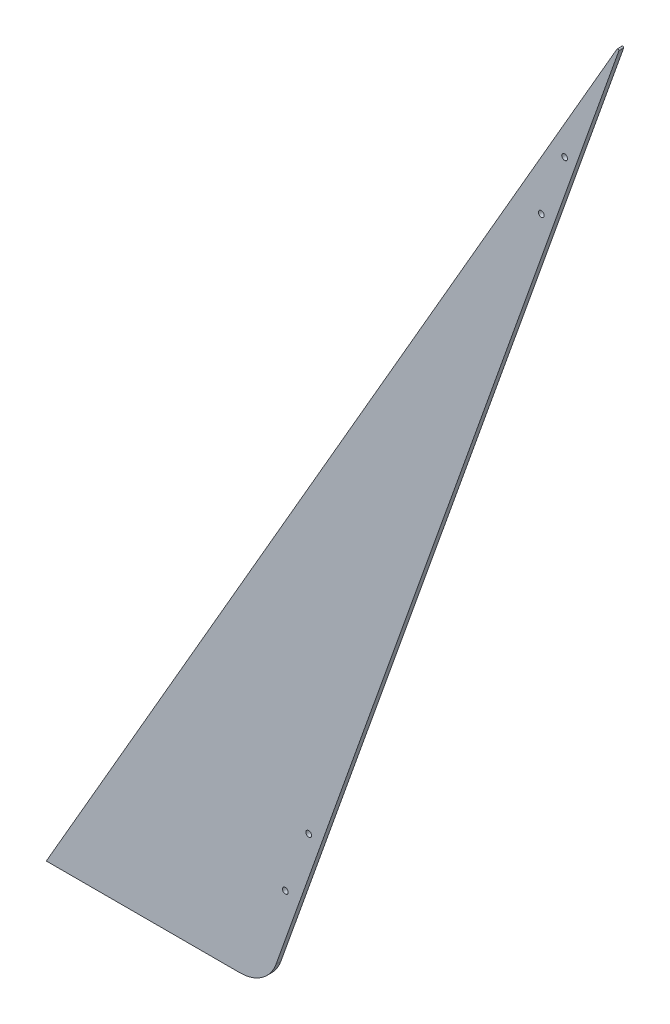
ISO-10303-21;
HEADER;
FILE_DESCRIPTION(('STEP AP214'),'2;1');
FILE_NAME('part.step','',(''),(''),'','','');
FILE_SCHEMA(('AUTOMOTIVE_DESIGN { 1 0 10303 214 1 1 1 1 }'));
ENDSEC;
DATA;
#1=APPLICATION_CONTEXT('core data for automotive mechanical design processes');
#2=APPLICATION_PROTOCOL_DEFINITION('international standard','automotive_design',2000,#1);
#3=PRODUCT_CONTEXT('',#1,'mechanical');
#4=PRODUCT('Part','Part','',(#3));
#5=PRODUCT_RELATED_PRODUCT_CATEGORY('part','',(#4));
#6=PRODUCT_DEFINITION_FORMATION('','',#4);
#7=PRODUCT_DEFINITION_CONTEXT('part definition',#1,'design');
#8=PRODUCT_DEFINITION('design','',#6,#7);
#9=PRODUCT_DEFINITION_SHAPE('','',#8);
#10=(LENGTH_UNIT() NAMED_UNIT(*) SI_UNIT(.MILLI.,.METRE.));
#11=(NAMED_UNIT(*) PLANE_ANGLE_UNIT() SI_UNIT($,.RADIAN.));
#12=(NAMED_UNIT(*) SI_UNIT($,.STERADIAN.) SOLID_ANGLE_UNIT());
#13=UNCERTAINTY_MEASURE_WITH_UNIT(LENGTH_MEASURE(1.E-05),#10,'distance_accuracy_value','');
#14=(GEOMETRIC_REPRESENTATION_CONTEXT(3) GLOBAL_UNCERTAINTY_ASSIGNED_CONTEXT((#13)) GLOBAL_UNIT_ASSIGNED_CONTEXT((#10,
#11,#12)) REPRESENTATION_CONTEXT('',''));
#15=CARTESIAN_POINT('',(0.,0.,0.));
#16=DIRECTION('',(0.,0.,1.));
#17=DIRECTION('',(1.,0.,0.));
#18=AXIS2_PLACEMENT_3D('',#15,#16,#17);
#19=CARTESIAN_POINT('',(600.444279957217,1040.,5.));
#20=DIRECTION('',(0.866025403784436,-0.500000000000004,0.));
#21=DIRECTION('',(0.500000000000004,0.866025403784436,0.));
#22=AXIS2_PLACEMENT_3D('',#19,#20,#21);
#23=PLANE('',#22);
#24=DIRECTION('',(-0.500000000000004,-0.866025403784436,0.));
#25=VECTOR('',#24,1.);
#26=CARTESIAN_POINT('',(600.444279957217,1040.,5.));
#27=LINE('',#26,#25);
#28=CARTESIAN_POINT('',(594.94716630705,1030.47871986293,5.));
#29=VERTEX_POINT('',#28);
#30=CARTESIAN_POINT('',(0.,0.,5.));
#31=VERTEX_POINT('',#30);
#32=EDGE_CURVE('E80',#29,#31,#27,.T.);
#33=ORIENTED_EDGE('',*,*,#32,.F.);
#34=DIRECTION('',(0.,0.,-1.));
#35=VECTOR('',#34,1.);
#36=CARTESIAN_POINT('',(594.94716630705,1030.47871986293,5.));
#37=LINE('',#36,#35);
#38=CARTESIAN_POINT('',(594.94716630705,1030.47871986293,0.));
#39=VERTEX_POINT('',#38);
#40=EDGE_CURVE('E116',#29,#39,#37,.T.);
#41=ORIENTED_EDGE('',*,*,#40,.T.);
#42=DIRECTION('',(-0.500000000000004,-0.866025403784436,0.));
#43=VECTOR('',#42,1.);
#44=CARTESIAN_POINT('',(600.444279957217,1040.,0.));
#45=LINE('',#44,#43);
#46=CARTESIAN_POINT('',(0.,0.,0.));
#47=VERTEX_POINT('',#46);
#48=EDGE_CURVE('E101',#39,#47,#45,.T.);
#49=ORIENTED_EDGE('',*,*,#48,.T.);
#50=DIRECTION('',(0.,0.,-1.));
#51=VECTOR('',#50,1.);
#52=CARTESIAN_POINT('',(0.,0.,5.));
#53=LINE('',#52,#51);
#54=EDGE_CURVE('E96',#31,#47,#53,.T.);
#55=ORIENTED_EDGE('',*,*,#54,.F.);
#56=EDGE_LOOP('',(#33,#41,#49,#55));
#57=FACE_BOUND('',#56,.T.);
#58=ADVANCED_FACE('F33',(#57),#23,.F.);
#59=CARTESIAN_POINT('',(0.,0.,5.));
#60=DIRECTION('',(0.,1.,0.));
#61=DIRECTION('',(0.,0.,1.));
#62=AXIS2_PLACEMENT_3D('',#59,#60,#61);
#63=PLANE('',#62);
#64=DIRECTION('',(1.,0.,0.));
#65=VECTOR('',#64,1.);
#66=CARTESIAN_POINT('',(0.,0.,0.));
#67=LINE('',#66,#65);
#68=CARTESIAN_POINT('',(201.786092628675,0.,0.));
#69=VERTEX_POINT('',#68);
#70=EDGE_CURVE('E120',#47,#69,#67,.T.);
#71=ORIENTED_EDGE('',*,*,#70,.T.);
#72=DIRECTION('',(0.,0.,-1.));
#73=VECTOR('',#72,1.);
#74=CARTESIAN_POINT('',(201.786092628675,0.,5.));
#75=LINE('',#74,#73);
#76=CARTESIAN_POINT('',(201.786092628675,0.,5.));
#77=VERTEX_POINT('',#76);
#78=EDGE_CURVE('E98',#69,#77,#75,.F.);
#79=ORIENTED_EDGE('',*,*,#78,.T.);
#80=DIRECTION('',(1.,0.,0.));
#81=VECTOR('',#80,1.);
#82=CARTESIAN_POINT('',(0.,0.,5.));
#83=LINE('',#82,#81);
#84=EDGE_CURVE('E83',#31,#77,#83,.T.);
#85=ORIENTED_EDGE('',*,*,#84,.F.);
#86=ORIENTED_EDGE('',*,*,#54,.T.);
#87=EDGE_LOOP('',(#71,#79,#85,#86));
#88=FACE_BOUND('',#87,.T.);
#89=ADVANCED_FACE('F95',(#88),#63,.F.);
#90=CARTESIAN_POINT('',(230.,0.,5.));
#91=DIRECTION('',(-0.942023975363263,0.335545570438345,0.));
#92=DIRECTION('',(-0.335545570438345,-0.942023975363263,0.));
#93=AXIS2_PLACEMENT_3D('',#90,#91,#92);
#94=PLANE('',#93);
#95=DIRECTION('',(0.335545570438345,0.942023975363263,0.));
#96=VECTOR('',#95,1.);
#97=CARTESIAN_POINT('',(230.,0.,0.));
#98=LINE('',#97,#96);
#99=CARTESIAN_POINT('',(239.467051643206,26.5781771824662,0.));
#100=VERTEX_POINT('',#99);
#101=CARTESIAN_POINT('',(596.755215686198,1029.64317429249,0.));
#102=VERTEX_POINT('',#101);
#103=EDGE_CURVE('E90',#100,#102,#98,.T.);
#104=ORIENTED_EDGE('',*,*,#103,.T.);
#105=DIRECTION('',(0.,0.,-1.));
#106=VECTOR('',#105,1.);
#107=CARTESIAN_POINT('',(596.755215686198,1029.64317429249,5.));
#108=LINE('',#107,#106);
#109=CARTESIAN_POINT('',(596.755215686198,1029.64317429249,5.));
#110=VERTEX_POINT('',#109);
#111=EDGE_CURVE('E41',#102,#110,#108,.F.);
#112=ORIENTED_EDGE('',*,*,#111,.T.);
#113=DIRECTION('',(0.335545570438345,0.942023975363263,0.));
#114=VECTOR('',#113,1.);
#115=CARTESIAN_POINT('',(230.,0.,5.));
#116=LINE('',#115,#114);
#117=CARTESIAN_POINT('',(239.467051643206,26.5781771824662,5.));
#118=VERTEX_POINT('',#117);
#119=EDGE_CURVE('E99',#118,#110,#116,.T.);
#120=ORIENTED_EDGE('',*,*,#119,.F.);
#121=DIRECTION('',(0.,0.,-1.));
#122=VECTOR('',#121,1.);
#123=CARTESIAN_POINT('',(239.467051643206,26.5781771824662,5.));
#124=LINE('',#123,#122);
#125=EDGE_CURVE('E103',#118,#100,#124,.T.);
#126=ORIENTED_EDGE('',*,*,#125,.T.);
#127=EDGE_LOOP('',(#104,#112,#120,#126));
#128=FACE_BOUND('',#127,.T.);
#129=ADVANCED_FACE('F152',(#128),#94,.F.);
#130=CARTESIAN_POINT('',(0.,0.,5.));
#131=DIRECTION('',(0.,0.,1.));
#132=DIRECTION('',(1.,0.,0.));
#133=AXIS2_PLACEMENT_3D('',#130,#131,#132);
#134=PLANE('',#133);
#135=CARTESIAN_POINT('',(249.14769163417,97.7585656821368,5.));
#136=DIRECTION('',(0.,0.,1.));
#137=DIRECTION('',(1.,0.,0.));
#138=AXIS2_PLACEMENT_3D('',#135,#136,#137);
#139=CIRCLE('',#138,2.99999999999999);
#140=CARTESIAN_POINT('',(252.14769163417,97.7585656821368,5.));
#141=VERTEX_POINT('',#140);
#142=EDGE_CURVE('E124',#141,#141,#139,.T.);
#143=ORIENTED_EDGE('',*,*,#142,.F.);
#144=EDGE_LOOP('',(#143));
#145=FACE_BOUND('',#144,.T.);
#146=CARTESIAN_POINT('',(273.494533388935,161.250543888588,5.));
#147=DIRECTION('',(0.,0.,1.));
#148=DIRECTION('',(1.,0.,0.));
#149=AXIS2_PLACEMENT_3D('',#146,#147,#148);
#150=CIRCLE('',#149,2.99999999999999);
#151=CARTESIAN_POINT('',(276.494533388935,161.250543888588,5.));
#152=VERTEX_POINT('',#151);
#153=EDGE_CURVE('E139',#152,#152,#150,.T.);
#154=ORIENTED_EDGE('',*,*,#153,.F.);
#155=EDGE_LOOP('',(#154));
#156=FACE_BOUND('',#155,.T.);
#157=CARTESIAN_POINT('',(515.885480129043,842.044902127844,5.));
#158=DIRECTION('',(0.,0.,1.));
#159=DIRECTION('',(1.,0.,0.));
#160=AXIS2_PLACEMENT_3D('',#157,#158,#159);
#161=CIRCLE('',#160,3.00000000000005);
#162=CARTESIAN_POINT('',(518.885480129043,842.044902127844,5.));
#163=VERTEX_POINT('',#162);
#164=EDGE_CURVE('E133',#163,#163,#161,.T.);
#165=ORIENTED_EDGE('',*,*,#164,.F.);
#166=EDGE_LOOP('',(#165));
#167=FACE_BOUND('',#166,.T.);
#168=CARTESIAN_POINT('',(540.232321883807,905.536880334295,5.));
#169=DIRECTION('',(0.,0.,1.));
#170=DIRECTION('',(1.,0.,0.));
#171=AXIS2_PLACEMENT_3D('',#168,#169,#170);
#172=CIRCLE('',#171,3.00000000000005);
#173=CARTESIAN_POINT('',(543.232321883807,905.536880334295,5.));
#174=VERTEX_POINT('',#173);
#175=EDGE_CURVE('E127',#174,#174,#172,.T.);
#176=ORIENTED_EDGE('',*,*,#175,.F.);
#177=EDGE_LOOP('',(#176));
#178=FACE_BOUND('',#177,.T.);
#179=ORIENTED_EDGE('',*,*,#119,.T.);
#180=CARTESIAN_POINT('',(595.813191710834,1029.97871986293,5.));
#181=DIRECTION('',(0.,0.,1.));
#182=DIRECTION('',(1.,0.,0.));
#183=AXIS2_PLACEMENT_3D('',#180,#181,#182);
#184=CIRCLE('',#183,1.);
#185=EDGE_CURVE('E11',#110,#29,#184,.T.);
#186=ORIENTED_EDGE('',*,*,#185,.T.);
#187=ORIENTED_EDGE('',*,*,#32,.T.);
#188=ORIENTED_EDGE('',*,*,#84,.T.);
#189=CARTESIAN_POINT('',(201.786092628675,40.,5.));
#190=DIRECTION('',(0.,0.,1.));
#191=DIRECTION('',(1.,0.,0.));
#192=AXIS2_PLACEMENT_3D('',#189,#190,#191);
#193=CIRCLE('',#192,40.);
#194=EDGE_CURVE('E114',#77,#118,#193,.T.);
#195=ORIENTED_EDGE('',*,*,#194,.T.);
#196=EDGE_LOOP('',(#179,#186,#187,#188,#195));
#197=FACE_BOUND('',#196,.T.);
#198=ADVANCED_FACE('F82',(#145,#156,#167,#178,#197),#134,.T.);
#199=CARTESIAN_POINT('',(0.,0.,0.));
#200=DIRECTION('',(0.,0.,1.));
#201=DIRECTION('',(1.,0.,0.));
#202=AXIS2_PLACEMENT_3D('',#199,#200,#201);
#203=PLANE('',#202);
#204=CARTESIAN_POINT('',(249.14769163417,97.7585656821368,0.));
#205=DIRECTION('',(0.,0.,1.));
#206=DIRECTION('',(1.,0.,0.));
#207=AXIS2_PLACEMENT_3D('',#204,#205,#206);
#208=CIRCLE('',#207,2.99999999999999);
#209=CARTESIAN_POINT('',(252.14769163417,97.7585656821368,0.));
#210=VERTEX_POINT('',#209);
#211=EDGE_CURVE('E121',#210,#210,#208,.T.);
#212=ORIENTED_EDGE('',*,*,#211,.T.);
#213=EDGE_LOOP('',(#212));
#214=FACE_BOUND('',#213,.T.);
#215=CARTESIAN_POINT('',(273.494533388935,161.250543888588,0.));
#216=DIRECTION('',(0.,0.,1.));
#217=DIRECTION('',(1.,0.,0.));
#218=AXIS2_PLACEMENT_3D('',#215,#216,#217);
#219=CIRCLE('',#218,2.99999999999999);
#220=CARTESIAN_POINT('',(276.494533388935,161.250543888588,0.));
#221=VERTEX_POINT('',#220);
#222=EDGE_CURVE('E142',#221,#221,#219,.T.);
#223=ORIENTED_EDGE('',*,*,#222,.T.);
#224=EDGE_LOOP('',(#223));
#225=FACE_BOUND('',#224,.T.);
#226=CARTESIAN_POINT('',(515.885480129043,842.044902127844,0.));
#227=DIRECTION('',(0.,0.,1.));
#228=DIRECTION('',(1.,0.,0.));
#229=AXIS2_PLACEMENT_3D('',#226,#227,#228);
#230=CIRCLE('',#229,3.00000000000005);
#231=CARTESIAN_POINT('',(518.885480129043,842.044902127844,0.));
#232=VERTEX_POINT('',#231);
#233=EDGE_CURVE('E136',#232,#232,#230,.T.);
#234=ORIENTED_EDGE('',*,*,#233,.T.);
#235=EDGE_LOOP('',(#234));
#236=FACE_BOUND('',#235,.T.);
#237=CARTESIAN_POINT('',(540.232321883807,905.536880334295,0.));
#238=DIRECTION('',(0.,0.,1.));
#239=DIRECTION('',(1.,0.,0.));
#240=AXIS2_PLACEMENT_3D('',#237,#238,#239);
#241=CIRCLE('',#240,3.00000000000005);
#242=CARTESIAN_POINT('',(543.232321883807,905.536880334295,0.));
#243=VERTEX_POINT('',#242);
#244=EDGE_CURVE('E130',#243,#243,#241,.T.);
#245=ORIENTED_EDGE('',*,*,#244,.T.);
#246=EDGE_LOOP('',(#245));
#247=FACE_BOUND('',#246,.T.);
#248=ORIENTED_EDGE('',*,*,#48,.F.);
#249=CARTESIAN_POINT('',(595.813191710834,1029.97871986293,0.));
#250=DIRECTION('',(0.,0.,1.));
#251=DIRECTION('',(1.,0.,0.));
#252=AXIS2_PLACEMENT_3D('',#249,#250,#251);
#253=CIRCLE('',#252,1.);
#254=EDGE_CURVE('E55',#39,#102,#253,.F.);
#255=ORIENTED_EDGE('',*,*,#254,.T.);
#256=ORIENTED_EDGE('',*,*,#103,.F.);
#257=CARTESIAN_POINT('',(201.786092628675,40.,0.));
#258=DIRECTION('',(0.,0.,1.));
#259=DIRECTION('',(1.,0.,0.));
#260=AXIS2_PLACEMENT_3D('',#257,#258,#259);
#261=CIRCLE('',#260,40.);
#262=EDGE_CURVE('E106',#100,#69,#261,.F.);
#263=ORIENTED_EDGE('',*,*,#262,.T.);
#264=ORIENTED_EDGE('',*,*,#70,.F.);
#265=EDGE_LOOP('',(#248,#255,#256,#263,#264));
#266=FACE_BOUND('',#265,.T.);
#267=ADVANCED_FACE('F119',(#214,#225,#236,#247,#266),#203,.F.);
#268=CARTESIAN_POINT('',(201.786092628675,40.,5.));
#269=DIRECTION('',(0.,0.,-1.));
#270=DIRECTION('',(-1.,0.,0.));
#271=AXIS2_PLACEMENT_3D('',#268,#269,#270);
#272=CYLINDRICAL_SURFACE('',#271,40.);
#273=ORIENTED_EDGE('',*,*,#194,.F.);
#274=ORIENTED_EDGE('',*,*,#78,.F.);
#275=ORIENTED_EDGE('',*,*,#262,.F.);
#276=ORIENTED_EDGE('',*,*,#125,.F.);
#277=EDGE_LOOP('',(#273,#274,#275,#276));
#278=FACE_BOUND('',#277,.T.);
#279=ADVANCED_FACE('F172',(#278),#272,.T.);
#280=CARTESIAN_POINT('',(595.813191710834,1029.97871986293,5.));
#281=DIRECTION('',(0.,0.,-1.));
#282=DIRECTION('',(-1.,0.,0.));
#283=AXIS2_PLACEMENT_3D('',#280,#281,#282);
#284=CYLINDRICAL_SURFACE('',#283,1.);
#285=ORIENTED_EDGE('',*,*,#185,.F.);
#286=ORIENTED_EDGE('',*,*,#111,.F.);
#287=ORIENTED_EDGE('',*,*,#254,.F.);
#288=ORIENTED_EDGE('',*,*,#40,.F.);
#289=EDGE_LOOP('',(#285,#286,#287,#288));
#290=FACE_BOUND('',#289,.T.);
#291=ADVANCED_FACE('F35',(#290),#284,.T.);
#292=CARTESIAN_POINT('',(540.232321883807,905.536880334295,0.));
#293=DIRECTION('',(0.,0.,1.));
#294=DIRECTION('',(1.,0.,0.));
#295=AXIS2_PLACEMENT_3D('',#292,#293,#294);
#296=CYLINDRICAL_SURFACE('',#295,3.00000000000005);
#297=ORIENTED_EDGE('',*,*,#244,.F.);
#298=EDGE_LOOP('',(#297));
#299=FACE_BOUND('',#298,.T.);
#300=ORIENTED_EDGE('',*,*,#175,.T.);
#301=EDGE_LOOP('',(#300));
#302=FACE_BOUND('',#301,.T.);
#303=ADVANCED_FACE('F160',(#299,#302),#296,.F.);
#304=CARTESIAN_POINT('',(515.885480129043,842.044902127844,0.));
#305=DIRECTION('',(0.,0.,1.));
#306=DIRECTION('',(1.,0.,0.));
#307=AXIS2_PLACEMENT_3D('',#304,#305,#306);
#308=CYLINDRICAL_SURFACE('',#307,3.00000000000005);
#309=ORIENTED_EDGE('',*,*,#233,.F.);
#310=EDGE_LOOP('',(#309));
#311=FACE_BOUND('',#310,.T.);
#312=ORIENTED_EDGE('',*,*,#164,.T.);
#313=EDGE_LOOP('',(#312));
#314=FACE_BOUND('',#313,.T.);
#315=ADVANCED_FACE('F162',(#311,#314),#308,.F.);
#316=CARTESIAN_POINT('',(273.494533388935,161.250543888588,0.));
#317=DIRECTION('',(0.,0.,1.));
#318=DIRECTION('',(1.,0.,0.));
#319=AXIS2_PLACEMENT_3D('',#316,#317,#318);
#320=CYLINDRICAL_SURFACE('',#319,2.99999999999999);
#321=ORIENTED_EDGE('',*,*,#222,.F.);
#322=EDGE_LOOP('',(#321));
#323=FACE_BOUND('',#322,.T.);
#324=ORIENTED_EDGE('',*,*,#153,.T.);
#325=EDGE_LOOP('',(#324));
#326=FACE_BOUND('',#325,.T.);
#327=ADVANCED_FACE('F169',(#323,#326),#320,.F.);
#328=CARTESIAN_POINT('',(249.14769163417,97.7585656821368,0.));
#329=DIRECTION('',(0.,0.,1.));
#330=DIRECTION('',(1.,0.,0.));
#331=AXIS2_PLACEMENT_3D('',#328,#329,#330);
#332=CYLINDRICAL_SURFACE('',#331,2.99999999999999);
#333=ORIENTED_EDGE('',*,*,#211,.F.);
#334=EDGE_LOOP('',(#333));
#335=FACE_BOUND('',#334,.T.);
#336=ORIENTED_EDGE('',*,*,#142,.T.);
#337=EDGE_LOOP('',(#336));
#338=FACE_BOUND('',#337,.T.);
#339=ADVANCED_FACE('F148',(#335,#338),#332,.F.);
#340=CLOSED_SHELL('',(#58,#89,#129,#198,#267,#279,#291,#303,#315,#327,#339));
#341=MANIFOLD_SOLID_BREP('B2',#340);
#342=ADVANCED_BREP_SHAPE_REPRESENTATION('',(#18,#341),#14);
#343=SHAPE_DEFINITION_REPRESENTATION(#9,#342);
ENDSEC;
END-ISO-10303-21;
